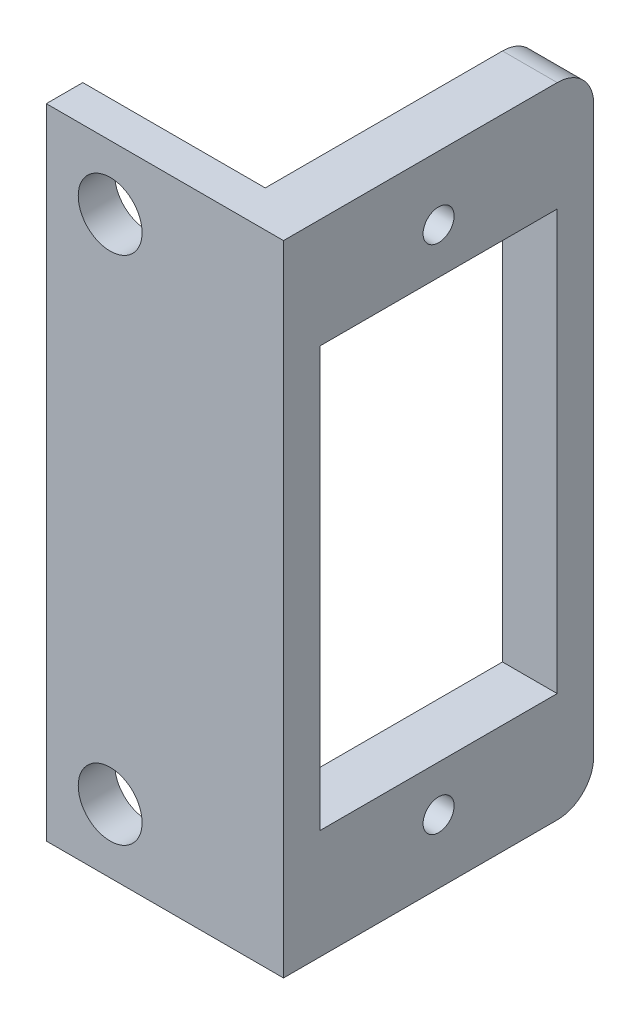
ISO-10303-21;
HEADER;
FILE_DESCRIPTION(('STEP AP214'),'2;1');
FILE_NAME('part.step','',(''),(''),'','','');
FILE_SCHEMA(('AUTOMOTIVE_DESIGN { 1 0 10303 214 1 1 1 1 }'));
ENDSEC;
DATA;
#1=APPLICATION_CONTEXT('core data for automotive mechanical design processes');
#2=APPLICATION_PROTOCOL_DEFINITION('international standard','automotive_design',2000,#1);
#3=PRODUCT_CONTEXT('',#1,'mechanical');
#4=PRODUCT('Part','Part','',(#3));
#5=PRODUCT_RELATED_PRODUCT_CATEGORY('part','',(#4));
#6=PRODUCT_DEFINITION_FORMATION('','',#4);
#7=PRODUCT_DEFINITION_CONTEXT('part definition',#1,'design');
#8=PRODUCT_DEFINITION('design','',#6,#7);
#9=PRODUCT_DEFINITION_SHAPE('','',#8);
#10=(LENGTH_UNIT() NAMED_UNIT(*) SI_UNIT(.MILLI.,.METRE.));
#11=(NAMED_UNIT(*) PLANE_ANGLE_UNIT() SI_UNIT($,.RADIAN.));
#12=(NAMED_UNIT(*) SI_UNIT($,.STERADIAN.) SOLID_ANGLE_UNIT());
#13=UNCERTAINTY_MEASURE_WITH_UNIT(LENGTH_MEASURE(1.E-05),#10,'distance_accuracy_value','');
#14=(GEOMETRIC_REPRESENTATION_CONTEXT(3) GLOBAL_UNCERTAINTY_ASSIGNED_CONTEXT((#13)) GLOBAL_UNIT_ASSIGNED_CONTEXT((#10,
#11,#12)) REPRESENTATION_CONTEXT('',''));
#15=CARTESIAN_POINT('',(0.,0.,0.));
#16=DIRECTION('',(0.,0.,1.));
#17=DIRECTION('',(1.,0.,0.));
#18=AXIS2_PLACEMENT_3D('',#15,#16,#17);
#19=CARTESIAN_POINT('',(-1.5,0.,0.));
#20=DIRECTION('',(-1.,0.,0.));
#21=DIRECTION('',(0.,0.,1.));
#22=AXIS2_PLACEMENT_3D('',#19,#20,#21);
#23=PLANE('',#22);
#24=CARTESIAN_POINT('',(-1.5,-14.,0.));
#25=DIRECTION('',(-1.,0.,0.));
#26=DIRECTION('',(0.,0.,1.));
#27=AXIS2_PLACEMENT_3D('',#24,#25,#26);
#28=CIRCLE('',#27,0.85);
#29=CARTESIAN_POINT('',(-1.5,-14.,0.85));
#30=VERTEX_POINT('',#29);
#31=EDGE_CURVE('E160',#30,#30,#28,.T.);
#32=ORIENTED_EDGE('',*,*,#31,.F.);
#33=EDGE_LOOP('',(#32));
#34=FACE_BOUND('',#33,.T.);
#35=CARTESIAN_POINT('',(-1.5,14.,0.));
#36=DIRECTION('',(-1.,0.,0.));
#37=DIRECTION('',(0.,0.,1.));
#38=AXIS2_PLACEMENT_3D('',#35,#36,#37);
#39=CIRCLE('',#38,0.85);
#40=CARTESIAN_POINT('',(-1.5,14.,0.85));
#41=VERTEX_POINT('',#40);
#42=EDGE_CURVE('E166',#41,#41,#39,.T.);
#43=ORIENTED_EDGE('',*,*,#42,.F.);
#44=EDGE_LOOP('',(#43));
#45=FACE_BOUND('',#44,.T.);
#46=DIRECTION('',(0.,0.,-1.));
#47=VECTOR('',#46,1.);
#48=CARTESIAN_POINT('',(-1.5,-17.5,8.5));
#49=LINE('',#48,#47);
#50=CARTESIAN_POINT('',(-1.5,-17.5,6.5));
#51=VERTEX_POINT('',#50);
#52=CARTESIAN_POINT('',(-1.5,-17.5,-6.5));
#53=VERTEX_POINT('',#52);
#54=EDGE_CURVE('E205',#51,#53,#49,.T.);
#55=ORIENTED_EDGE('',*,*,#54,.F.);
#56=DIRECTION('',(0.,1.,0.));
#57=VECTOR('',#56,1.);
#58=CARTESIAN_POINT('',(-1.5,0.,6.5));
#59=LINE('',#58,#57);
#60=CARTESIAN_POINT('',(-1.5,-11.5,6.5));
#61=VERTEX_POINT('',#60);
#62=EDGE_CURVE('E158',#51,#61,#59,.T.);
#63=ORIENTED_EDGE('',*,*,#62,.T.);
#64=DIRECTION('',(0.,0.,-1.));
#65=VECTOR('',#64,1.);
#66=CARTESIAN_POINT('',(-1.5,-11.5,-6.5));
#67=LINE('',#66,#65);
#68=CARTESIAN_POINT('',(-1.5,-11.5,-6.5));
#69=VERTEX_POINT('',#68);
#70=EDGE_CURVE('E192',#61,#69,#67,.T.);
#71=ORIENTED_EDGE('',*,*,#70,.T.);
#72=DIRECTION('',(0.,1.,0.));
#73=VECTOR('',#72,1.);
#74=CARTESIAN_POINT('',(-1.5,-11.5,-6.5));
#75=LINE('',#74,#73);
#76=CARTESIAN_POINT('',(-1.5,11.5,-6.5));
#77=VERTEX_POINT('',#76);
#78=EDGE_CURVE('E172',#69,#77,#75,.T.);
#79=ORIENTED_EDGE('',*,*,#78,.T.);
#80=DIRECTION('',(0.,0.,1.));
#81=VECTOR('',#80,1.);
#82=CARTESIAN_POINT('',(-1.5,11.5,-6.5));
#83=LINE('',#82,#81);
#84=CARTESIAN_POINT('',(-1.5,11.5,6.5));
#85=VERTEX_POINT('',#84);
#86=EDGE_CURVE('E175',#77,#85,#83,.T.);
#87=ORIENTED_EDGE('',*,*,#86,.T.);
#88=CARTESIAN_POINT('',(-1.5,17.5,6.5));
#89=VERTEX_POINT('',#88);
#90=EDGE_CURVE('E157',#85,#89,#59,.T.);
#91=ORIENTED_EDGE('',*,*,#90,.T.);
#92=DIRECTION('',(0.,0.,1.));
#93=VECTOR('',#92,1.);
#94=CARTESIAN_POINT('',(-1.5,17.5,8.5));
#95=LINE('',#94,#93);
#96=CARTESIAN_POINT('',(-1.5,17.5,-6.5));
#97=VERTEX_POINT('',#96);
#98=EDGE_CURVE('E212',#97,#89,#95,.T.);
#99=ORIENTED_EDGE('',*,*,#98,.F.);
#100=CARTESIAN_POINT('',(-1.5,15.5,-6.5));
#101=DIRECTION('',(-1.,0.,0.));
#102=DIRECTION('',(0.,0.,1.));
#103=AXIS2_PLACEMENT_3D('',#100,#101,#102);
#104=CIRCLE('',#103,2.);
#105=CARTESIAN_POINT('',(-1.5,15.5,-8.5));
#106=VERTEX_POINT('',#105);
#107=EDGE_CURVE('E220',#97,#106,#104,.T.);
#108=ORIENTED_EDGE('',*,*,#107,.T.);
#109=DIRECTION('',(0.,1.,0.));
#110=VECTOR('',#109,1.);
#111=CARTESIAN_POINT('',(-1.5,-17.5,-8.5));
#112=LINE('',#111,#110);
#113=CARTESIAN_POINT('',(-1.5,-15.5,-8.5));
#114=VERTEX_POINT('',#113);
#115=EDGE_CURVE('E201',#114,#106,#112,.T.);
#116=ORIENTED_EDGE('',*,*,#115,.F.);
#117=CARTESIAN_POINT('',(-1.5,-15.5,-6.5));
#118=DIRECTION('',(-1.,0.,0.));
#119=DIRECTION('',(0.,0.,1.));
#120=AXIS2_PLACEMENT_3D('',#117,#118,#119);
#121=CIRCLE('',#120,2.);
#122=EDGE_CURVE('E222',#114,#53,#121,.T.);
#123=ORIENTED_EDGE('',*,*,#122,.T.);
#124=EDGE_LOOP('',(#55,#63,#71,#79,#87,#91,#99,#108,#116,#123));
#125=FACE_BOUND('',#124,.T.);
#126=ADVANCED_FACE('F32',(#34,#45,#125),#23,.T.);
#127=CARTESIAN_POINT('',(1.5,-17.5,-8.5));
#128=DIRECTION('',(0.,0.,1.));
#129=DIRECTION('',(1.,0.,0.));
#130=AXIS2_PLACEMENT_3D('',#127,#128,#129);
#131=PLANE('',#130);
#132=DIRECTION('',(0.,1.,0.));
#133=VECTOR('',#132,1.);
#134=CARTESIAN_POINT('',(1.5,-17.5,-8.5));
#135=LINE('',#134,#133);
#136=CARTESIAN_POINT('',(1.5,-15.5,-8.5));
#137=VERTEX_POINT('',#136);
#138=CARTESIAN_POINT('',(1.5,15.5,-8.5));
#139=VERTEX_POINT('',#138);
#140=EDGE_CURVE('E202',#137,#139,#135,.T.);
#141=ORIENTED_EDGE('',*,*,#140,.F.);
#142=DIRECTION('',(-1.,0.,0.));
#143=VECTOR('',#142,1.);
#144=CARTESIAN_POINT('',(1.5,-15.5,-8.5));
#145=LINE('',#144,#143);
#146=EDGE_CURVE('E217',#137,#114,#145,.T.);
#147=ORIENTED_EDGE('',*,*,#146,.T.);
#148=ORIENTED_EDGE('',*,*,#115,.T.);
#149=DIRECTION('',(-1.,0.,0.));
#150=VECTOR('',#149,1.);
#151=CARTESIAN_POINT('',(1.5,15.5,-8.5));
#152=LINE('',#151,#150);
#153=EDGE_CURVE('E131',#106,#139,#152,.F.);
#154=ORIENTED_EDGE('',*,*,#153,.T.);
#155=EDGE_LOOP('',(#141,#147,#148,#154));
#156=FACE_BOUND('',#155,.T.);
#157=ADVANCED_FACE('F237',(#156),#131,.F.);
#158=CARTESIAN_POINT('',(1.5,17.5,8.5));
#159=DIRECTION('',(0.,-1.,0.));
#160=DIRECTION('',(0.,0.,-1.));
#161=AXIS2_PLACEMENT_3D('',#158,#159,#160);
#162=PLANE('',#161);
#163=DIRECTION('',(-1.,0.,0.));
#164=VECTOR('',#163,1.);
#165=CARTESIAN_POINT('',(1.5,17.5,8.5));
#166=LINE('',#165,#164);
#167=CARTESIAN_POINT('',(1.5,17.5,8.5));
#168=VERTEX_POINT('',#167);
#169=CARTESIAN_POINT('',(-11.5,17.5,8.5));
#170=VERTEX_POINT('',#169);
#171=EDGE_CURVE('E123',#168,#170,#166,.T.);
#172=ORIENTED_EDGE('',*,*,#171,.F.);
#173=DIRECTION('',(0.,0.,1.));
#174=VECTOR('',#173,1.);
#175=CARTESIAN_POINT('',(1.5,17.5,8.5));
#176=LINE('',#175,#174);
#177=CARTESIAN_POINT('',(1.5,17.5,-6.5));
#178=VERTEX_POINT('',#177);
#179=EDGE_CURVE('E204',#178,#168,#176,.T.);
#180=ORIENTED_EDGE('',*,*,#179,.F.);
#181=DIRECTION('',(-1.,0.,0.));
#182=VECTOR('',#181,1.);
#183=CARTESIAN_POINT('',(1.5,17.5,-6.5));
#184=LINE('',#183,#182);
#185=EDGE_CURVE('E11',#178,#97,#184,.T.);
#186=ORIENTED_EDGE('',*,*,#185,.T.);
#187=ORIENTED_EDGE('',*,*,#98,.T.);
#188=DIRECTION('',(1.,0.,0.));
#189=VECTOR('',#188,1.);
#190=CARTESIAN_POINT('',(1.5,17.5,6.5));
#191=LINE('',#190,#189);
#192=CARTESIAN_POINT('',(-11.5,17.5,6.5));
#193=VERTEX_POINT('',#192);
#194=EDGE_CURVE('E47',#193,#89,#191,.T.);
#195=ORIENTED_EDGE('',*,*,#194,.F.);
#196=DIRECTION('',(0.,0.,1.));
#197=VECTOR('',#196,1.);
#198=CARTESIAN_POINT('',(-11.5,17.5,-30.8363094051889));
#199=LINE('',#198,#197);
#200=EDGE_CURVE('E135',#193,#170,#199,.T.);
#201=ORIENTED_EDGE('',*,*,#200,.T.);
#202=EDGE_LOOP('',(#172,#180,#186,#187,#195,#201));
#203=FACE_BOUND('',#202,.T.);
#204=ADVANCED_FACE('F136',(#203),#162,.F.);
#205=CARTESIAN_POINT('',(1.5,-17.5,8.5));
#206=DIRECTION('',(0.,0.,-1.));
#207=DIRECTION('',(-1.,0.,0.));
#208=AXIS2_PLACEMENT_3D('',#205,#206,#207);
#209=PLANE('',#208);
#210=CARTESIAN_POINT('',(-8.,-14.,8.5));
#211=DIRECTION('',(0.,0.,-1.));
#212=DIRECTION('',(-1.,0.,0.));
#213=AXIS2_PLACEMENT_3D('',#210,#211,#212);
#214=CIRCLE('',#213,1.75000000000001);
#215=CARTESIAN_POINT('',(-9.75,-14.,8.5));
#216=VERTEX_POINT('',#215);
#217=EDGE_CURVE('E268',#216,#216,#214,.T.);
#218=ORIENTED_EDGE('',*,*,#217,.T.);
#219=EDGE_LOOP('',(#218));
#220=FACE_BOUND('',#219,.T.);
#221=CARTESIAN_POINT('',(-8.,14.,8.5));
#222=DIRECTION('',(0.,0.,-1.));
#223=DIRECTION('',(-1.,0.,0.));
#224=AXIS2_PLACEMENT_3D('',#221,#222,#223);
#225=CIRCLE('',#224,1.75000000000001);
#226=CARTESIAN_POINT('',(-9.75,14.,8.5));
#227=VERTEX_POINT('',#226);
#228=EDGE_CURVE('E148',#227,#227,#225,.T.);
#229=ORIENTED_EDGE('',*,*,#228,.T.);
#230=EDGE_LOOP('',(#229));
#231=FACE_BOUND('',#230,.T.);
#232=ORIENTED_EDGE('',*,*,#171,.T.);
#233=DIRECTION('',(0.,-1.,0.));
#234=VECTOR('',#233,1.);
#235=CARTESIAN_POINT('',(-11.5,17.5,8.5));
#236=LINE('',#235,#234);
#237=CARTESIAN_POINT('',(-11.5,-17.5,8.5));
#238=VERTEX_POINT('',#237);
#239=EDGE_CURVE('E128',#170,#238,#236,.T.);
#240=ORIENTED_EDGE('',*,*,#239,.T.);
#241=DIRECTION('',(-1.,0.,0.));
#242=VECTOR('',#241,1.);
#243=CARTESIAN_POINT('',(1.5,-17.5,8.5));
#244=LINE('',#243,#242);
#245=CARTESIAN_POINT('',(1.5,-17.5,8.5));
#246=VERTEX_POINT('',#245);
#247=EDGE_CURVE('E132',#246,#238,#244,.T.);
#248=ORIENTED_EDGE('',*,*,#247,.F.);
#249=DIRECTION('',(0.,-1.,0.));
#250=VECTOR('',#249,1.);
#251=CARTESIAN_POINT('',(1.5,-17.5,8.5));
#252=LINE('',#251,#250);
#253=EDGE_CURVE('E129',#168,#246,#252,.T.);
#254=ORIENTED_EDGE('',*,*,#253,.F.);
#255=EDGE_LOOP('',(#232,#240,#248,#254));
#256=FACE_BOUND('',#255,.T.);
#257=ADVANCED_FACE('F125',(#220,#231,#256),#209,.F.);
#258=CARTESIAN_POINT('',(1.5,-17.5,8.5));
#259=DIRECTION('',(0.,1.,0.));
#260=DIRECTION('',(0.,0.,1.));
#261=AXIS2_PLACEMENT_3D('',#258,#259,#260);
#262=PLANE('',#261);
#263=ORIENTED_EDGE('',*,*,#247,.T.);
#264=DIRECTION('',(0.,0.,1.));
#265=VECTOR('',#264,1.);
#266=CARTESIAN_POINT('',(-11.5,-17.5,-30.8363094051889));
#267=LINE('',#266,#265);
#268=CARTESIAN_POINT('',(-11.5,-17.5,6.5));
#269=VERTEX_POINT('',#268);
#270=EDGE_CURVE('E140',#269,#238,#267,.T.);
#271=ORIENTED_EDGE('',*,*,#270,.F.);
#272=DIRECTION('',(-1.,0.,0.));
#273=VECTOR('',#272,1.);
#274=CARTESIAN_POINT('',(1.5,-17.5,6.5));
#275=LINE('',#274,#273);
#276=EDGE_CURVE('E152',#51,#269,#275,.T.);
#277=ORIENTED_EDGE('',*,*,#276,.F.);
#278=ORIENTED_EDGE('',*,*,#54,.T.);
#279=DIRECTION('',(-1.,0.,0.));
#280=VECTOR('',#279,1.);
#281=CARTESIAN_POINT('',(1.5,-17.5,-6.5));
#282=LINE('',#281,#280);
#283=CARTESIAN_POINT('',(1.5,-17.5,-6.5));
#284=VERTEX_POINT('',#283);
#285=EDGE_CURVE('E225',#53,#284,#282,.F.);
#286=ORIENTED_EDGE('',*,*,#285,.T.);
#287=DIRECTION('',(0.,0.,-1.));
#288=VECTOR('',#287,1.);
#289=CARTESIAN_POINT('',(1.5,-17.5,8.5));
#290=LINE('',#289,#288);
#291=EDGE_CURVE('E208',#246,#284,#290,.T.);
#292=ORIENTED_EDGE('',*,*,#291,.F.);
#293=EDGE_LOOP('',(#263,#271,#277,#278,#286,#292));
#294=FACE_BOUND('',#293,.T.);
#295=ADVANCED_FACE('F263',(#294),#262,.F.);
#296=CARTESIAN_POINT('',(1.5,0.,0.));
#297=DIRECTION('',(-1.,0.,0.));
#298=DIRECTION('',(0.,0.,1.));
#299=AXIS2_PLACEMENT_3D('',#296,#297,#298);
#300=PLANE('',#299);
#301=DIRECTION('',(0.,0.,-1.));
#302=VECTOR('',#301,1.);
#303=CARTESIAN_POINT('',(1.5,-11.5,-6.5));
#304=LINE('',#303,#302);
#305=CARTESIAN_POINT('',(1.5,-11.5,6.5));
#306=VERTEX_POINT('',#305);
#307=CARTESIAN_POINT('',(1.5,-11.5,-6.5));
#308=VERTEX_POINT('',#307);
#309=EDGE_CURVE('E180',#306,#308,#304,.T.);
#310=ORIENTED_EDGE('',*,*,#309,.F.);
#311=DIRECTION('',(0.,-1.,0.));
#312=VECTOR('',#311,1.);
#313=CARTESIAN_POINT('',(1.5,-11.5,6.5));
#314=LINE('',#313,#312);
#315=CARTESIAN_POINT('',(1.5,11.5,6.5));
#316=VERTEX_POINT('',#315);
#317=EDGE_CURVE('E178',#316,#306,#314,.T.);
#318=ORIENTED_EDGE('',*,*,#317,.F.);
#319=DIRECTION('',(0.,0.,1.));
#320=VECTOR('',#319,1.);
#321=CARTESIAN_POINT('',(1.5,11.5,-6.5));
#322=LINE('',#321,#320);
#323=CARTESIAN_POINT('',(1.5,11.5,-6.5));
#324=VERTEX_POINT('',#323);
#325=EDGE_CURVE('E186',#324,#316,#322,.T.);
#326=ORIENTED_EDGE('',*,*,#325,.F.);
#327=DIRECTION('',(0.,1.,0.));
#328=VECTOR('',#327,1.);
#329=CARTESIAN_POINT('',(1.5,-11.5,-6.5));
#330=LINE('',#329,#328);
#331=EDGE_CURVE('E183',#308,#324,#330,.T.);
#332=ORIENTED_EDGE('',*,*,#331,.F.);
#333=EDGE_LOOP('',(#310,#318,#326,#332));
#334=FACE_BOUND('',#333,.T.);
#335=ORIENTED_EDGE('',*,*,#291,.T.);
#336=CARTESIAN_POINT('',(1.5,-15.5,-6.5));
#337=DIRECTION('',(-1.,0.,0.));
#338=DIRECTION('',(0.,0.,1.));
#339=AXIS2_PLACEMENT_3D('',#336,#337,#338);
#340=CIRCLE('',#339,2.);
#341=EDGE_CURVE('E40',#284,#137,#340,.F.);
#342=ORIENTED_EDGE('',*,*,#341,.T.);
#343=ORIENTED_EDGE('',*,*,#140,.T.);
#344=CARTESIAN_POINT('',(1.5,15.5,-6.5));
#345=DIRECTION('',(-1.,0.,0.));
#346=DIRECTION('',(0.,0.,1.));
#347=AXIS2_PLACEMENT_3D('',#344,#345,#346);
#348=CIRCLE('',#347,2.);
#349=EDGE_CURVE('E55',#139,#178,#348,.F.);
#350=ORIENTED_EDGE('',*,*,#349,.T.);
#351=ORIENTED_EDGE('',*,*,#179,.T.);
#352=ORIENTED_EDGE('',*,*,#253,.T.);
#353=EDGE_LOOP('',(#335,#342,#343,#350,#351,#352));
#354=FACE_BOUND('',#353,.T.);
#355=CARTESIAN_POINT('',(1.5,14.,0.));
#356=DIRECTION('',(-1.,0.,0.));
#357=DIRECTION('',(0.,0.,1.));
#358=AXIS2_PLACEMENT_3D('',#355,#356,#357);
#359=CIRCLE('',#358,0.85);
#360=CARTESIAN_POINT('',(1.5,14.,0.85));
#361=VERTEX_POINT('',#360);
#362=EDGE_CURVE('E169',#361,#361,#359,.F.);
#363=ORIENTED_EDGE('',*,*,#362,.F.);
#364=EDGE_LOOP('',(#363));
#365=FACE_BOUND('',#364,.T.);
#366=CARTESIAN_POINT('',(1.5,-14.,0.));
#367=DIRECTION('',(-1.,0.,0.));
#368=DIRECTION('',(0.,0.,1.));
#369=AXIS2_PLACEMENT_3D('',#366,#367,#368);
#370=CIRCLE('',#369,0.85);
#371=CARTESIAN_POINT('',(1.5,-14.,0.85));
#372=VERTEX_POINT('',#371);
#373=EDGE_CURVE('E163',#372,#372,#370,.F.);
#374=ORIENTED_EDGE('',*,*,#373,.F.);
#375=EDGE_LOOP('',(#374));
#376=FACE_BOUND('',#375,.T.);
#377=ADVANCED_FACE('F230',(#334,#354,#365,#376),#300,.F.);
#378=CARTESIAN_POINT('',(-1.501,-11.5,6.5));
#379=DIRECTION('',(0.,0.,1.));
#380=DIRECTION('',(1.,0.,0.));
#381=AXIS2_PLACEMENT_3D('',#378,#379,#380);
#382=PLANE('',#381);
#383=CARTESIAN_POINT('',(-8.,-14.,6.5));
#384=DIRECTION('',(0.,0.,1.));
#385=DIRECTION('',(1.,0.,0.));
#386=AXIS2_PLACEMENT_3D('',#383,#384,#385);
#387=CIRCLE('',#386,1.75000000000001);
#388=CARTESIAN_POINT('',(-6.24999999999999,-14.,6.5));
#389=VERTEX_POINT('',#388);
#390=EDGE_CURVE('E266',#389,#389,#387,.T.);
#391=ORIENTED_EDGE('',*,*,#390,.T.);
#392=EDGE_LOOP('',(#391));
#393=FACE_BOUND('',#392,.T.);
#394=CARTESIAN_POINT('',(-8.,14.,6.5));
#395=DIRECTION('',(0.,0.,1.));
#396=DIRECTION('',(1.,0.,0.));
#397=AXIS2_PLACEMENT_3D('',#394,#395,#396);
#398=CIRCLE('',#397,1.75000000000001);
#399=CARTESIAN_POINT('',(-6.24999999999999,14.,6.5));
#400=VERTEX_POINT('',#399);
#401=EDGE_CURVE('E145',#400,#400,#398,.T.);
#402=ORIENTED_EDGE('',*,*,#401,.T.);
#403=EDGE_LOOP('',(#402));
#404=FACE_BOUND('',#403,.T.);
#405=DIRECTION('',(1.,0.,0.));
#406=VECTOR('',#405,1.);
#407=CARTESIAN_POINT('',(-1.501,11.5,6.5));
#408=LINE('',#407,#406);
#409=EDGE_CURVE('E190',#85,#316,#408,.T.);
#410=ORIENTED_EDGE('',*,*,#409,.T.);
#411=ORIENTED_EDGE('',*,*,#317,.T.);
#412=DIRECTION('',(1.,0.,0.));
#413=VECTOR('',#412,1.);
#414=CARTESIAN_POINT('',(-1.501,-11.5,6.5));
#415=LINE('',#414,#413);
#416=EDGE_CURVE('E189',#61,#306,#415,.T.);
#417=ORIENTED_EDGE('',*,*,#416,.F.);
#418=ORIENTED_EDGE('',*,*,#62,.F.);
#419=ORIENTED_EDGE('',*,*,#276,.T.);
#420=DIRECTION('',(0.,1.,0.));
#421=VECTOR('',#420,1.);
#422=CARTESIAN_POINT('',(-11.5,17.5,6.5));
#423=LINE('',#422,#421);
#424=EDGE_CURVE('E154',#269,#193,#423,.T.);
#425=ORIENTED_EDGE('',*,*,#424,.T.);
#426=ORIENTED_EDGE('',*,*,#194,.T.);
#427=ORIENTED_EDGE('',*,*,#90,.F.);
#428=EDGE_LOOP('',(#410,#411,#417,#418,#419,#425,#426,#427));
#429=FACE_BOUND('',#428,.T.);
#430=ADVANCED_FACE('F247',(#393,#404,#429),#382,.F.);
#431=CARTESIAN_POINT('',(-1.501,11.5,-6.5));
#432=DIRECTION('',(0.,1.,0.));
#433=DIRECTION('',(0.,0.,1.));
#434=AXIS2_PLACEMENT_3D('',#431,#432,#433);
#435=PLANE('',#434);
#436=DIRECTION('',(1.,0.,0.));
#437=VECTOR('',#436,1.);
#438=CARTESIAN_POINT('',(-1.501,11.5,-6.5));
#439=LINE('',#438,#437);
#440=EDGE_CURVE('E193',#77,#324,#439,.T.);
#441=ORIENTED_EDGE('',*,*,#440,.T.);
#442=ORIENTED_EDGE('',*,*,#325,.T.);
#443=ORIENTED_EDGE('',*,*,#409,.F.);
#444=ORIENTED_EDGE('',*,*,#86,.F.);
#445=EDGE_LOOP('',(#441,#442,#443,#444));
#446=FACE_BOUND('',#445,.T.);
#447=ADVANCED_FACE('F249',(#446),#435,.F.);
#448=CARTESIAN_POINT('',(-1.501,-11.5,-6.5));
#449=DIRECTION('',(0.,0.,-1.));
#450=DIRECTION('',(-1.,0.,0.));
#451=AXIS2_PLACEMENT_3D('',#448,#449,#450);
#452=PLANE('',#451);
#453=DIRECTION('',(1.,0.,0.));
#454=VECTOR('',#453,1.);
#455=CARTESIAN_POINT('',(-1.501,-11.5,-6.5));
#456=LINE('',#455,#454);
#457=EDGE_CURVE('E195',#69,#308,#456,.T.);
#458=ORIENTED_EDGE('',*,*,#457,.T.);
#459=ORIENTED_EDGE('',*,*,#331,.T.);
#460=ORIENTED_EDGE('',*,*,#440,.F.);
#461=ORIENTED_EDGE('',*,*,#78,.F.);
#462=EDGE_LOOP('',(#458,#459,#460,#461));
#463=FACE_BOUND('',#462,.T.);
#464=ADVANCED_FACE('F329',(#463),#452,.F.);
#465=CARTESIAN_POINT('',(-1.501,-11.5,-6.5));
#466=DIRECTION('',(0.,-1.,0.));
#467=DIRECTION('',(0.,0.,-1.));
#468=AXIS2_PLACEMENT_3D('',#465,#466,#467);
#469=PLANE('',#468);
#470=ORIENTED_EDGE('',*,*,#416,.T.);
#471=ORIENTED_EDGE('',*,*,#309,.T.);
#472=ORIENTED_EDGE('',*,*,#457,.F.);
#473=ORIENTED_EDGE('',*,*,#70,.F.);
#474=EDGE_LOOP('',(#470,#471,#472,#473));
#475=FACE_BOUND('',#474,.T.);
#476=ADVANCED_FACE('F259',(#475),#469,.F.);
#477=CARTESIAN_POINT('',(1.501,14.,0.));
#478=DIRECTION('',(-1.,0.,0.));
#479=DIRECTION('',(0.,0.,1.));
#480=AXIS2_PLACEMENT_3D('',#477,#478,#479);
#481=CYLINDRICAL_SURFACE('',#480,0.85);
#482=CARTESIAN_POINT('',(-1.5,14.,0.85));
#483=CARTESIAN_POINT('',(-1.46875,14.,0.85));
#484=CARTESIAN_POINT('',(-1.4375,14.,0.85));
#485=CARTESIAN_POINT('',(-1.375,14.,0.85));
#486=CARTESIAN_POINT('',(-1.34375,14.,0.85));
#487=CARTESIAN_POINT('',(-1.28125,14.,0.85));
#488=CARTESIAN_POINT('',(-1.25,14.,0.85));
#489=CARTESIAN_POINT('',(-1.1875,14.,0.85));
#490=CARTESIAN_POINT('',(-1.15625,14.,0.85));
#491=CARTESIAN_POINT('',(-1.09375,14.,0.85));
#492=CARTESIAN_POINT('',(-1.0625,14.,0.85));
#493=CARTESIAN_POINT('',(-1.,14.,0.85));
#494=CARTESIAN_POINT('',(-0.96875,14.,0.85));
#495=CARTESIAN_POINT('',(-0.90625,14.,0.85));
#496=CARTESIAN_POINT('',(-0.874999999999999,14.,0.85));
#497=CARTESIAN_POINT('',(-0.8125,14.,0.85));
#498=CARTESIAN_POINT('',(-0.78125,14.,0.85));
#499=CARTESIAN_POINT('',(-0.71875,14.,0.85));
#500=CARTESIAN_POINT('',(-0.6875,14.,0.85));
#501=CARTESIAN_POINT('',(-0.625,14.,0.85));
#502=CARTESIAN_POINT('',(-0.59375,14.,0.85));
#503=CARTESIAN_POINT('',(-0.53125,14.,0.85));
#504=CARTESIAN_POINT('',(-0.5,14.,0.85));
#505=CARTESIAN_POINT('',(-0.4375,14.,0.85));
#506=CARTESIAN_POINT('',(-0.40625,14.,0.85));
#507=CARTESIAN_POINT('',(-0.34375,14.,0.85));
#508=CARTESIAN_POINT('',(-0.3125,14.,0.85));
#509=CARTESIAN_POINT('',(-0.25,14.,0.85));
#510=CARTESIAN_POINT('',(-0.21875,14.,0.85));
#511=CARTESIAN_POINT('',(-0.15625,14.,0.85));
#512=CARTESIAN_POINT('',(-0.125,14.,0.85));
#513=CARTESIAN_POINT('',(-0.0624999999999998,14.,0.85));
#514=CARTESIAN_POINT('',(-0.0312499999999998,14.,0.85));
#515=CARTESIAN_POINT('',(0.0312500000000002,14.,0.85));
#516=CARTESIAN_POINT('',(0.0625000000000003,14.,0.85));
#517=CARTESIAN_POINT('',(0.125,14.,0.85));
#518=CARTESIAN_POINT('',(0.15625,14.,0.85));
#519=CARTESIAN_POINT('',(0.21875,14.,0.85));
#520=CARTESIAN_POINT('',(0.25,14.,0.85));
#521=CARTESIAN_POINT('',(0.3125,14.,0.85));
#522=CARTESIAN_POINT('',(0.34375,14.,0.85));
#523=CARTESIAN_POINT('',(0.40625,14.,0.85));
#524=CARTESIAN_POINT('',(0.4375,14.,0.85));
#525=CARTESIAN_POINT('',(0.5,14.,0.85));
#526=CARTESIAN_POINT('',(0.53125,14.,0.85));
#527=CARTESIAN_POINT('',(0.59375,14.,0.85));
#528=CARTESIAN_POINT('',(0.625,14.,0.85));
#529=CARTESIAN_POINT('',(0.6875,14.,0.85));
#530=CARTESIAN_POINT('',(0.71875,14.,0.85));
#531=CARTESIAN_POINT('',(0.78125,14.,0.85));
#532=CARTESIAN_POINT('',(0.8125,14.,0.85));
#533=CARTESIAN_POINT('',(0.875,14.,0.85));
#534=CARTESIAN_POINT('',(0.90625,14.,0.85));
#535=CARTESIAN_POINT('',(0.96875,14.,0.85));
#536=CARTESIAN_POINT('',(1.,14.,0.85));
#537=CARTESIAN_POINT('',(1.0625,14.,0.85));
#538=CARTESIAN_POINT('',(1.09375,14.,0.85));
#539=CARTESIAN_POINT('',(1.15625,14.,0.85));
#540=CARTESIAN_POINT('',(1.1875,14.,0.85));
#541=CARTESIAN_POINT('',(1.25,14.,0.85));
#542=CARTESIAN_POINT('',(1.28125,14.,0.85));
#543=CARTESIAN_POINT('',(1.34375,14.,0.85));
#544=CARTESIAN_POINT('',(1.375,14.,0.85));
#545=CARTESIAN_POINT('',(1.4375,14.,0.85));
#546=CARTESIAN_POINT('',(1.46875,14.,0.85));
#547=CARTESIAN_POINT('',(1.5,14.,0.85));
#548=B_SPLINE_CURVE_WITH_KNOTS('',3,(#482,#483,#484,#485,#486,#487,#488,#489,#490,#491,#492,
#493,#494,#495,#496,#497,#498,#499,#500,#501,#502,#503,#504,#505,#506,#507,#508,#509,#510,#511,
#512,#513,#514,#515,#516,#517,#518,#519,#520,#521,#522,#523,#524,#525,#526,#527,#528,#529,#530,
#531,#532,#533,#534,#535,#536,#537,#538,#539,#540,#541,#542,#543,#544,#545,#546,#547),
.UNSPECIFIED.,.F.,.F.,(4,2,2,2,2,2,2,2,2,2,2,2,2,2,2,2,2,2,2,2,2,2,2,2,2,2,2,2,2,2,2,2,4),(0.,
0.0937500000000001,0.1875,0.28125,0.375,0.46875,0.5625,0.65625,0.75,0.84375,0.9375,1.03125,
1.125,1.21875,1.3125,1.40625,1.5,1.59375,1.6875,1.78125,1.875,1.96875,2.0625,2.15625,2.25,
2.34375,2.4375,2.53125,2.625,2.71875,2.8125,2.90625,3.),.UNSPECIFIED.);
#549=EDGE_CURVE('BSEAM317',#41,#361,#548,.T.);
#550=ORIENTED_EDGE('',*,*,#42,.T.);
#551=ORIENTED_EDGE('',*,*,#362,.T.);
#552=ORIENTED_EDGE('',*,*,#549,.T.);
#553=ORIENTED_EDGE('',*,*,#549,.F.);
#554=EDGE_LOOP('',(#550,#552,#551,#553));
#555=FACE_BOUND('',#554,.T.);
#556=ADVANCED_FACE('F317',(#555),#481,.F.);
#557=CARTESIAN_POINT('',(1.501,-14.,0.));
#558=DIRECTION('',(-1.,0.,0.));
#559=DIRECTION('',(0.,0.,1.));
#560=AXIS2_PLACEMENT_3D('',#557,#558,#559);
#561=CYLINDRICAL_SURFACE('',#560,0.85);
#562=CARTESIAN_POINT('',(-1.5,-14.,0.85));
#563=CARTESIAN_POINT('',(-1.46875,-14.,0.85));
#564=CARTESIAN_POINT('',(-1.4375,-14.,0.85));
#565=CARTESIAN_POINT('',(-1.375,-14.,0.85));
#566=CARTESIAN_POINT('',(-1.34375,-14.,0.85));
#567=CARTESIAN_POINT('',(-1.28125,-14.,0.85));
#568=CARTESIAN_POINT('',(-1.25,-14.,0.85));
#569=CARTESIAN_POINT('',(-1.1875,-14.,0.85));
#570=CARTESIAN_POINT('',(-1.15625,-14.,0.85));
#571=CARTESIAN_POINT('',(-1.09375,-14.,0.85));
#572=CARTESIAN_POINT('',(-1.0625,-14.,0.85));
#573=CARTESIAN_POINT('',(-1.,-14.,0.85));
#574=CARTESIAN_POINT('',(-0.96875,-14.,0.85));
#575=CARTESIAN_POINT('',(-0.90625,-14.,0.85));
#576=CARTESIAN_POINT('',(-0.874999999999999,-14.,0.85));
#577=CARTESIAN_POINT('',(-0.8125,-14.,0.85));
#578=CARTESIAN_POINT('',(-0.78125,-14.,0.85));
#579=CARTESIAN_POINT('',(-0.71875,-14.,0.85));
#580=CARTESIAN_POINT('',(-0.6875,-14.,0.85));
#581=CARTESIAN_POINT('',(-0.625,-14.,0.85));
#582=CARTESIAN_POINT('',(-0.59375,-14.,0.85));
#583=CARTESIAN_POINT('',(-0.53125,-14.,0.85));
#584=CARTESIAN_POINT('',(-0.5,-14.,0.85));
#585=CARTESIAN_POINT('',(-0.4375,-14.,0.85));
#586=CARTESIAN_POINT('',(-0.40625,-14.,0.85));
#587=CARTESIAN_POINT('',(-0.34375,-14.,0.85));
#588=CARTESIAN_POINT('',(-0.3125,-14.,0.85));
#589=CARTESIAN_POINT('',(-0.25,-14.,0.85));
#590=CARTESIAN_POINT('',(-0.21875,-14.,0.85));
#591=CARTESIAN_POINT('',(-0.15625,-14.,0.85));
#592=CARTESIAN_POINT('',(-0.125,-14.,0.85));
#593=CARTESIAN_POINT('',(-0.0624999999999998,-14.,0.85));
#594=CARTESIAN_POINT('',(-0.0312499999999998,-14.,0.85));
#595=CARTESIAN_POINT('',(0.0312500000000002,-14.,0.85));
#596=CARTESIAN_POINT('',(0.0625000000000003,-14.,0.85));
#597=CARTESIAN_POINT('',(0.125,-14.,0.85));
#598=CARTESIAN_POINT('',(0.15625,-14.,0.85));
#599=CARTESIAN_POINT('',(0.21875,-14.,0.85));
#600=CARTESIAN_POINT('',(0.25,-14.,0.85));
#601=CARTESIAN_POINT('',(0.3125,-14.,0.85));
#602=CARTESIAN_POINT('',(0.34375,-14.,0.85));
#603=CARTESIAN_POINT('',(0.40625,-14.,0.85));
#604=CARTESIAN_POINT('',(0.4375,-14.,0.85));
#605=CARTESIAN_POINT('',(0.5,-14.,0.85));
#606=CARTESIAN_POINT('',(0.53125,-14.,0.85));
#607=CARTESIAN_POINT('',(0.59375,-14.,0.85));
#608=CARTESIAN_POINT('',(0.625,-14.,0.85));
#609=CARTESIAN_POINT('',(0.6875,-14.,0.85));
#610=CARTESIAN_POINT('',(0.71875,-14.,0.85));
#611=CARTESIAN_POINT('',(0.78125,-14.,0.85));
#612=CARTESIAN_POINT('',(0.8125,-14.,0.85));
#613=CARTESIAN_POINT('',(0.875,-14.,0.85));
#614=CARTESIAN_POINT('',(0.90625,-14.,0.85));
#615=CARTESIAN_POINT('',(0.96875,-14.,0.85));
#616=CARTESIAN_POINT('',(1.,-14.,0.85));
#617=CARTESIAN_POINT('',(1.0625,-14.,0.85));
#618=CARTESIAN_POINT('',(1.09375,-14.,0.85));
#619=CARTESIAN_POINT('',(1.15625,-14.,0.85));
#620=CARTESIAN_POINT('',(1.1875,-14.,0.85));
#621=CARTESIAN_POINT('',(1.25,-14.,0.85));
#622=CARTESIAN_POINT('',(1.28125,-14.,0.85));
#623=CARTESIAN_POINT('',(1.34375,-14.,0.85));
#624=CARTESIAN_POINT('',(1.375,-14.,0.85));
#625=CARTESIAN_POINT('',(1.4375,-14.,0.85));
#626=CARTESIAN_POINT('',(1.46875,-14.,0.85));
#627=CARTESIAN_POINT('',(1.5,-14.,0.85));
#628=B_SPLINE_CURVE_WITH_KNOTS('',3,(#562,#563,#564,#565,#566,#567,#568,#569,#570,#571,#572,
#573,#574,#575,#576,#577,#578,#579,#580,#581,#582,#583,#584,#585,#586,#587,#588,#589,#590,#591,
#592,#593,#594,#595,#596,#597,#598,#599,#600,#601,#602,#603,#604,#605,#606,#607,#608,#609,#610,
#611,#612,#613,#614,#615,#616,#617,#618,#619,#620,#621,#622,#623,#624,#625,#626,#627),
.UNSPECIFIED.,.F.,.F.,(4,2,2,2,2,2,2,2,2,2,2,2,2,2,2,2,2,2,2,2,2,2,2,2,2,2,2,2,2,2,2,2,4),(0.,
0.0937500000000001,0.1875,0.28125,0.375,0.46875,0.5625,0.65625,0.75,0.84375,0.9375,1.03125,
1.125,1.21875,1.3125,1.40625,1.5,1.59375,1.6875,1.78125,1.875,1.96875,2.0625,2.15625,2.25,
2.34375,2.4375,2.53125,2.625,2.71875,2.8125,2.90625,3.),.UNSPECIFIED.);
#629=EDGE_CURVE('BSEAM312',#30,#372,#628,.T.);
#630=ORIENTED_EDGE('',*,*,#31,.T.);
#631=ORIENTED_EDGE('',*,*,#373,.T.);
#632=ORIENTED_EDGE('',*,*,#629,.T.);
#633=ORIENTED_EDGE('',*,*,#629,.F.);
#634=EDGE_LOOP('',(#630,#632,#631,#633));
#635=FACE_BOUND('',#634,.T.);
#636=ADVANCED_FACE('F312',(#635),#561,.F.);
#637=CARTESIAN_POINT('',(1.5,-15.5,-6.5));
#638=DIRECTION('',(-1.,0.,0.));
#639=DIRECTION('',(0.,0.,1.));
#640=AXIS2_PLACEMENT_3D('',#637,#638,#639);
#641=CYLINDRICAL_SURFACE('',#640,2.);
#642=ORIENTED_EDGE('',*,*,#341,.F.);
#643=ORIENTED_EDGE('',*,*,#285,.F.);
#644=ORIENTED_EDGE('',*,*,#122,.F.);
#645=ORIENTED_EDGE('',*,*,#146,.F.);
#646=EDGE_LOOP('',(#642,#643,#644,#645));
#647=FACE_BOUND('',#646,.T.);
#648=ADVANCED_FACE('F240',(#647),#641,.T.);
#649=CARTESIAN_POINT('',(1.5,15.5,-6.5));
#650=DIRECTION('',(-1.,0.,0.));
#651=DIRECTION('',(0.,0.,1.));
#652=AXIS2_PLACEMENT_3D('',#649,#650,#651);
#653=CYLINDRICAL_SURFACE('',#652,2.);
#654=ORIENTED_EDGE('',*,*,#349,.F.);
#655=ORIENTED_EDGE('',*,*,#153,.F.);
#656=ORIENTED_EDGE('',*,*,#107,.F.);
#657=ORIENTED_EDGE('',*,*,#185,.F.);
#658=EDGE_LOOP('',(#654,#655,#656,#657));
#659=FACE_BOUND('',#658,.T.);
#660=ADVANCED_FACE('F34',(#659),#653,.T.);
#661=CARTESIAN_POINT('',(-11.5,17.5,-30.8363094051889));
#662=DIRECTION('',(-1.,0.,0.));
#663=DIRECTION('',(0.,0.,1.));
#664=AXIS2_PLACEMENT_3D('',#661,#662,#663);
#665=PLANE('',#664);
#666=ORIENTED_EDGE('',*,*,#424,.F.);
#667=ORIENTED_EDGE('',*,*,#270,.T.);
#668=ORIENTED_EDGE('',*,*,#239,.F.);
#669=ORIENTED_EDGE('',*,*,#200,.F.);
#670=EDGE_LOOP('',(#666,#667,#668,#669));
#671=FACE_BOUND('',#670,.T.);
#672=ADVANCED_FACE('F143',(#671),#665,.T.);
#673=CARTESIAN_POINT('',(-8.,14.,8.501));
#674=DIRECTION('',(0.,0.,-1.));
#675=DIRECTION('',(-1.,0.,0.));
#676=AXIS2_PLACEMENT_3D('',#673,#674,#675);
#677=CYLINDRICAL_SURFACE('',#676,1.75000000000001);
#678=ORIENTED_EDGE('',*,*,#401,.F.);
#679=EDGE_LOOP('',(#678));
#680=FACE_BOUND('',#679,.T.);
#681=ORIENTED_EDGE('',*,*,#228,.F.);
#682=EDGE_LOOP('',(#681));
#683=FACE_BOUND('',#682,.T.);
#684=ADVANCED_FACE('F279',(#680,#683),#677,.F.);
#685=CARTESIAN_POINT('',(-8.,-14.,8.501));
#686=DIRECTION('',(0.,0.,-1.));
#687=DIRECTION('',(-1.,0.,0.));
#688=AXIS2_PLACEMENT_3D('',#685,#686,#687);
#689=CYLINDRICAL_SURFACE('',#688,1.75000000000001);
#690=ORIENTED_EDGE('',*,*,#390,.F.);
#691=EDGE_LOOP('',(#690));
#692=FACE_BOUND('',#691,.T.);
#693=ORIENTED_EDGE('',*,*,#217,.F.);
#694=EDGE_LOOP('',(#693));
#695=FACE_BOUND('',#694,.T.);
#696=ADVANCED_FACE('F276',(#692,#695),#689,.F.);
#697=CLOSED_SHELL('',(#126,#157,#204,#257,#295,#377,#430,#447,#464,#476,#556,#636,#648,#660,
#672,#684,#696));
#698=MANIFOLD_SOLID_BREP('B2',#697);
#699=ADVANCED_BREP_SHAPE_REPRESENTATION('',(#18,#698),#14);
#700=SHAPE_DEFINITION_REPRESENTATION(#9,#699);
ENDSEC;
END-ISO-10303-21;
